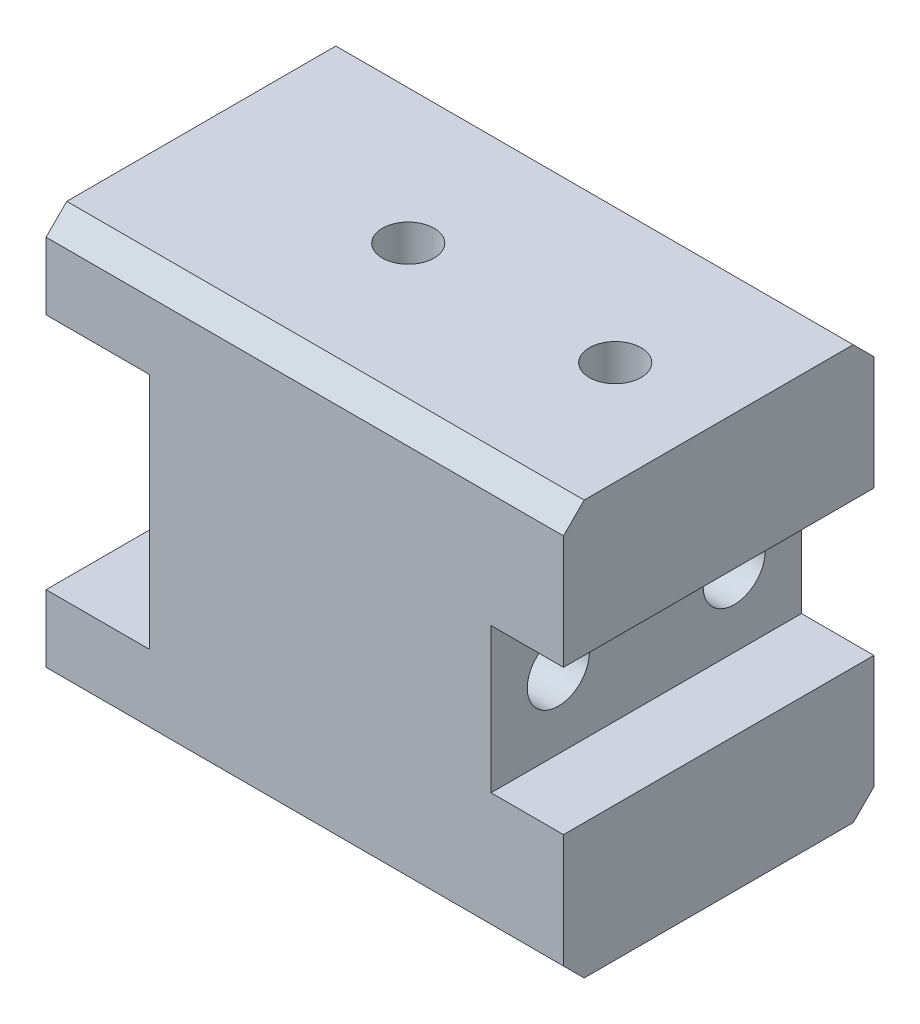
ISO-10303-21;
HEADER;
FILE_DESCRIPTION(('STEP AP214'),'2;1');
FILE_NAME('part.step','',(''),(''),'','','');
FILE_SCHEMA(('AUTOMOTIVE_DESIGN { 1 0 10303 214 1 1 1 1 }'));
ENDSEC;
DATA;
#1=APPLICATION_CONTEXT('core data for automotive mechanical design processes');
#2=APPLICATION_PROTOCOL_DEFINITION('international standard','automotive_design',2000,#1);
#3=PRODUCT_CONTEXT('',#1,'mechanical');
#4=PRODUCT('Part','Part','',(#3));
#5=PRODUCT_RELATED_PRODUCT_CATEGORY('part','',(#4));
#6=PRODUCT_DEFINITION_FORMATION('','',#4);
#7=PRODUCT_DEFINITION_CONTEXT('part definition',#1,'design');
#8=PRODUCT_DEFINITION('design','',#6,#7);
#9=PRODUCT_DEFINITION_SHAPE('','',#8);
#10=(LENGTH_UNIT() NAMED_UNIT(*) SI_UNIT(.MILLI.,.METRE.));
#11=(NAMED_UNIT(*) PLANE_ANGLE_UNIT() SI_UNIT($,.RADIAN.));
#12=(NAMED_UNIT(*) SI_UNIT($,.STERADIAN.) SOLID_ANGLE_UNIT());
#13=UNCERTAINTY_MEASURE_WITH_UNIT(LENGTH_MEASURE(1.E-05),#10,'distance_accuracy_value','');
#14=(GEOMETRIC_REPRESENTATION_CONTEXT(3) GLOBAL_UNCERTAINTY_ASSIGNED_CONTEXT((#13)) GLOBAL_UNIT_ASSIGNED_CONTEXT((#10,
#11,#12)) REPRESENTATION_CONTEXT('',''));
#15=CARTESIAN_POINT('',(0.,0.,0.));
#16=DIRECTION('',(0.,0.,1.));
#17=DIRECTION('',(1.,0.,0.));
#18=AXIS2_PLACEMENT_3D('',#15,#16,#17);
#19=CARTESIAN_POINT('',(25.,0.,0.));
#20=DIRECTION('',(1.,0.,0.));
#21=DIRECTION('',(0.,0.,-1.));
#22=AXIS2_PLACEMENT_3D('',#19,#20,#21);
#23=PLANE('',#22);
#24=DIRECTION('',(0.,0.,1.));
#25=VECTOR('',#24,1.);
#26=CARTESIAN_POINT('',(25.,3.5,-7.5));
#27=LINE('',#26,#25);
#28=CARTESIAN_POINT('',(25.,3.5,-7.5));
#29=VERTEX_POINT('',#28);
#30=CARTESIAN_POINT('',(25.,3.5,7.5));
#31=VERTEX_POINT('',#30);
#32=EDGE_CURVE('E170',#29,#31,#27,.T.);
#33=ORIENTED_EDGE('',*,*,#32,.F.);
#34=DIRECTION('',(0.,1.,0.));
#35=VECTOR('',#34,1.);
#36=CARTESIAN_POINT('',(25.,-10.,-7.5));
#37=LINE('',#36,#35);
#38=CARTESIAN_POINT('',(25.,9.,-7.5));
#39=VERTEX_POINT('',#38);
#40=EDGE_CURVE('E259',#29,#39,#37,.T.);
#41=ORIENTED_EDGE('',*,*,#40,.T.);
#42=DIRECTION('',(0.,-0.70710678118655,-0.707106781186545));
#43=VECTOR('',#42,1.);
#44=CARTESIAN_POINT('',(25.,8.24999999999997,-8.25000000000002));
#45=LINE('',#44,#43);
#46=CARTESIAN_POINT('',(25.,10.,-6.5));
#47=VERTEX_POINT('',#46);
#48=EDGE_CURVE('E306',#39,#47,#45,.F.);
#49=ORIENTED_EDGE('',*,*,#48,.T.);
#50=DIRECTION('',(0.,0.,1.));
#51=VECTOR('',#50,1.);
#52=CARTESIAN_POINT('',(25.,10.,-7.5));
#53=LINE('',#52,#51);
#54=CARTESIAN_POINT('',(25.,10.,6.5));
#55=VERTEX_POINT('',#54);
#56=EDGE_CURVE('E264',#47,#55,#53,.T.);
#57=ORIENTED_EDGE('',*,*,#56,.T.);
#58=DIRECTION('',(0.,0.707106781186547,-0.707106781186548));
#59=VECTOR('',#58,1.);
#60=CARTESIAN_POINT('',(25.,8.25000000000001,8.24999999999999));
#61=LINE('',#60,#59);
#62=CARTESIAN_POINT('',(25.,9.,7.5));
#63=VERTEX_POINT('',#62);
#64=EDGE_CURVE('E303',#55,#63,#61,.F.);
#65=ORIENTED_EDGE('',*,*,#64,.T.);
#66=DIRECTION('',(0.,-1.,0.));
#67=VECTOR('',#66,1.);
#68=CARTESIAN_POINT('',(25.,-10.,7.5));
#69=LINE('',#68,#67);
#70=EDGE_CURVE('E251',#63,#31,#69,.T.);
#71=ORIENTED_EDGE('',*,*,#70,.T.);
#72=EDGE_LOOP('',(#33,#41,#49,#57,#65,#71));
#73=FACE_BOUND('',#72,.T.);
#74=ADVANCED_FACE('F38',(#73),#23,.T.);
#75=CARTESIAN_POINT('',(25.,0.,-4.25));
#76=DIRECTION('',(-1.,0.,0.));
#77=DIRECTION('',(0.,0.,1.));
#78=AXIS2_PLACEMENT_3D('',#75,#76,#77);
#79=CYLINDRICAL_SURFACE('',#78,1.5);
#80=CARTESIAN_POINT('',(5.,0.,-4.25));
#81=DIRECTION('',(-1.,0.,0.));
#82=DIRECTION('',(0.,0.,1.));
#83=AXIS2_PLACEMENT_3D('',#80,#81,#82);
#84=CIRCLE('',#83,1.5);
#85=CARTESIAN_POINT('',(5.,0.,-2.75));
#86=VERTEX_POINT('',#85);
#87=EDGE_CURVE('E194',#86,#86,#84,.T.);
#88=ORIENTED_EDGE('',*,*,#87,.T.);
#89=EDGE_LOOP('',(#88));
#90=FACE_BOUND('',#89,.T.);
#91=CARTESIAN_POINT('',(21.5,0.,-4.25));
#92=DIRECTION('',(1.,0.,0.));
#93=DIRECTION('',(0.,0.,-1.));
#94=AXIS2_PLACEMENT_3D('',#91,#92,#93);
#95=CIRCLE('',#94,1.5);
#96=CARTESIAN_POINT('',(21.5,0.,-5.75));
#97=VERTEX_POINT('',#96);
#98=EDGE_CURVE('E185',#97,#97,#95,.F.);
#99=ORIENTED_EDGE('',*,*,#98,.F.);
#100=EDGE_LOOP('',(#99));
#101=FACE_BOUND('',#100,.T.);
#102=ADVANCED_FACE('F384',(#90,#101),#79,.F.);
#103=CARTESIAN_POINT('',(25.,0.,4.25));
#104=DIRECTION('',(-1.,0.,0.));
#105=DIRECTION('',(0.,0.,1.));
#106=AXIS2_PLACEMENT_3D('',#103,#104,#105);
#107=CYLINDRICAL_SURFACE('',#106,1.5);
#108=CARTESIAN_POINT('',(5.,0.,4.25));
#109=DIRECTION('',(-1.,0.,0.));
#110=DIRECTION('',(0.,0.,1.));
#111=AXIS2_PLACEMENT_3D('',#108,#109,#110);
#112=CIRCLE('',#111,1.5);
#113=CARTESIAN_POINT('',(5.,0.,5.75));
#114=VERTEX_POINT('',#113);
#115=EDGE_CURVE('E206',#114,#114,#112,.T.);
#116=ORIENTED_EDGE('',*,*,#115,.T.);
#117=EDGE_LOOP('',(#116));
#118=FACE_BOUND('',#117,.T.);
#119=CARTESIAN_POINT('',(21.5,0.,4.25));
#120=DIRECTION('',(1.,0.,0.));
#121=DIRECTION('',(0.,0.,-1.));
#122=AXIS2_PLACEMENT_3D('',#119,#120,#121);
#123=CIRCLE('',#122,1.5);
#124=CARTESIAN_POINT('',(21.5,0.,2.75));
#125=VERTEX_POINT('',#124);
#126=EDGE_CURVE('E42',#125,#125,#123,.F.);
#127=ORIENTED_EDGE('',*,*,#126,.F.);
#128=EDGE_LOOP('',(#127));
#129=FACE_BOUND('',#128,.T.);
#130=ADVANCED_FACE('F390',(#118,#129),#107,.F.);
#131=CARTESIAN_POINT('',(0.,0.,0.));
#132=DIRECTION('',(1.,0.,0.));
#133=DIRECTION('',(0.,0.,-1.));
#134=AXIS2_PLACEMENT_3D('',#131,#132,#133);
#135=PLANE('',#134);
#136=DIRECTION('',(0.,0.,1.));
#137=VECTOR('',#136,1.);
#138=CARTESIAN_POINT('',(0.,10.,-7.5));
#139=LINE('',#138,#137);
#140=CARTESIAN_POINT('',(0.,10.,-6.5));
#141=VERTEX_POINT('',#140);
#142=CARTESIAN_POINT('',(0.,10.,6.5));
#143=VERTEX_POINT('',#142);
#144=EDGE_CURVE('E280',#141,#143,#139,.T.);
#145=ORIENTED_EDGE('',*,*,#144,.F.);
#146=DIRECTION('',(0.,0.70710678118655,0.707106781186545));
#147=VECTOR('',#146,1.);
#148=CARTESIAN_POINT('',(0.,10.,-6.5));
#149=LINE('',#148,#147);
#150=CARTESIAN_POINT('',(0.,9.,-7.5));
#151=VERTEX_POINT('',#150);
#152=EDGE_CURVE('E11',#141,#151,#149,.F.);
#153=ORIENTED_EDGE('',*,*,#152,.T.);
#154=DIRECTION('',(0.,1.,0.));
#155=VECTOR('',#154,1.);
#156=CARTESIAN_POINT('',(0.,-10.,-7.5));
#157=LINE('',#156,#155);
#158=CARTESIAN_POINT('',(0.,5.75,-7.5));
#159=VERTEX_POINT('',#158);
#160=EDGE_CURVE('E276',#159,#151,#157,.T.);
#161=ORIENTED_EDGE('',*,*,#160,.F.);
#162=DIRECTION('',(0.,0.,-1.));
#163=VECTOR('',#162,1.);
#164=CARTESIAN_POINT('',(0.,5.75000000000001,7.5));
#165=LINE('',#164,#163);
#166=CARTESIAN_POINT('',(0.,5.75000000000001,7.5));
#167=VERTEX_POINT('',#166);
#168=EDGE_CURVE('E219',#167,#159,#165,.T.);
#169=ORIENTED_EDGE('',*,*,#168,.F.);
#170=DIRECTION('',(0.,-1.,0.));
#171=VECTOR('',#170,1.);
#172=CARTESIAN_POINT('',(0.,-10.,7.5));
#173=LINE('',#172,#171);
#174=CARTESIAN_POINT('',(0.,9.,7.5));
#175=VERTEX_POINT('',#174);
#176=EDGE_CURVE('E269',#175,#167,#173,.T.);
#177=ORIENTED_EDGE('',*,*,#176,.F.);
#178=DIRECTION('',(0.,-0.707106781186547,0.707106781186548));
#179=VECTOR('',#178,1.);
#180=CARTESIAN_POINT('',(0.,9.,7.5));
#181=LINE('',#180,#179);
#182=EDGE_CURVE('E48',#175,#143,#181,.F.);
#183=ORIENTED_EDGE('',*,*,#182,.T.);
#184=EDGE_LOOP('',(#145,#153,#161,#169,#177,#183));
#185=FACE_BOUND('',#184,.T.);
#186=ADVANCED_FACE('F368',(#185),#135,.F.);
#187=CARTESIAN_POINT('',(25.,-10.,7.5));
#188=DIRECTION('',(0.,0.,-1.));
#189=DIRECTION('',(0.,1.,0.));
#190=AXIS2_PLACEMENT_3D('',#187,#188,#189);
#191=PLANE('',#190);
#192=DIRECTION('',(0.,-1.,0.));
#193=VECTOR('',#192,1.);
#194=CARTESIAN_POINT('',(21.5,-3.5,7.5));
#195=LINE('',#194,#193);
#196=CARTESIAN_POINT('',(21.5,3.5,7.5));
#197=VERTEX_POINT('',#196);
#198=CARTESIAN_POINT('',(21.5,-3.5,7.5));
#199=VERTEX_POINT('',#198);
#200=EDGE_CURVE('E159',#197,#199,#195,.T.);
#201=ORIENTED_EDGE('',*,*,#200,.F.);
#202=DIRECTION('',(1.,0.,0.));
#203=VECTOR('',#202,1.);
#204=CARTESIAN_POINT('',(21.5,3.5,7.5));
#205=LINE('',#204,#203);
#206=EDGE_CURVE('E339',#197,#31,#205,.T.);
#207=ORIENTED_EDGE('',*,*,#206,.T.);
#208=ORIENTED_EDGE('',*,*,#70,.F.);
#209=DIRECTION('',(-1.,0.,0.));
#210=VECTOR('',#209,1.);
#211=CARTESIAN_POINT('',(25.,9.,7.5));
#212=LINE('',#211,#210);
#213=EDGE_CURVE('E315',#63,#175,#212,.T.);
#214=ORIENTED_EDGE('',*,*,#213,.T.);
#215=ORIENTED_EDGE('',*,*,#176,.T.);
#216=DIRECTION('',(-1.,0.,0.));
#217=VECTOR('',#216,1.);
#218=CARTESIAN_POINT('',(5.,5.75000000000001,7.5));
#219=LINE('',#218,#217);
#220=CARTESIAN_POINT('',(5.,5.75000000000001,7.5));
#221=VERTEX_POINT('',#220);
#222=EDGE_CURVE('E240',#221,#167,#219,.T.);
#223=ORIENTED_EDGE('',*,*,#222,.F.);
#224=DIRECTION('',(0.,1.,0.));
#225=VECTOR('',#224,1.);
#226=CARTESIAN_POINT('',(5.,-5.74999999999999,7.5));
#227=LINE('',#226,#225);
#228=CARTESIAN_POINT('',(5.,-5.74999999999999,7.5));
#229=VERTEX_POINT('',#228);
#230=EDGE_CURVE('E223',#229,#221,#227,.T.);
#231=ORIENTED_EDGE('',*,*,#230,.F.);
#232=DIRECTION('',(-1.,0.,0.));
#233=VECTOR('',#232,1.);
#234=CARTESIAN_POINT('',(5.,-5.74999999999999,7.5));
#235=LINE('',#234,#233);
#236=CARTESIAN_POINT('',(0.,-5.74999999999999,7.5));
#237=VERTEX_POINT('',#236);
#238=EDGE_CURVE('E244',#229,#237,#235,.T.);
#239=ORIENTED_EDGE('',*,*,#238,.T.);
#240=CARTESIAN_POINT('',(0.,-9.,7.5));
#241=VERTEX_POINT('',#240);
#242=EDGE_CURVE('E239',#237,#241,#173,.T.);
#243=ORIENTED_EDGE('',*,*,#242,.T.);
#244=DIRECTION('',(1.,0.,0.));
#245=VECTOR('',#244,1.);
#246=CARTESIAN_POINT('',(25.,-9.,7.5));
#247=LINE('',#246,#245);
#248=CARTESIAN_POINT('',(25.,-9.,7.5));
#249=VERTEX_POINT('',#248);
#250=EDGE_CURVE('E319',#241,#249,#247,.T.);
#251=ORIENTED_EDGE('',*,*,#250,.T.);
#252=CARTESIAN_POINT('',(25.,-3.5,7.5));
#253=VERTEX_POINT('',#252);
#254=EDGE_CURVE('E175',#253,#249,#69,.T.);
#255=ORIENTED_EDGE('',*,*,#254,.F.);
#256=DIRECTION('',(1.,0.,0.));
#257=VECTOR('',#256,1.);
#258=CARTESIAN_POINT('',(21.5,-3.5,7.5));
#259=LINE('',#258,#257);
#260=EDGE_CURVE('E55',#199,#253,#259,.T.);
#261=ORIENTED_EDGE('',*,*,#260,.F.);
#262=EDGE_LOOP('',(#201,#207,#208,#214,#215,#223,#231,#239,#243,#251,#255,#261));
#263=FACE_BOUND('',#262,.T.);
#264=ADVANCED_FACE('F173',(#263),#191,.F.);
#265=CARTESIAN_POINT('',(25.,-10.,-7.5));
#266=DIRECTION('',(0.,1.,0.));
#267=DIRECTION('',(0.,0.,1.));
#268=AXIS2_PLACEMENT_3D('',#265,#266,#267);
#269=PLANE('',#268);
#270=CARTESIAN_POINT('',(20.,-10.,0.));
#271=DIRECTION('',(0.,1.,0.));
#272=DIRECTION('',(0.,0.,1.));
#273=AXIS2_PLACEMENT_3D('',#270,#271,#272);
#274=CIRCLE('',#273,1.25);
#275=CARTESIAN_POINT('',(20.,-10.,1.25));
#276=VERTEX_POINT('',#275);
#277=EDGE_CURVE('E190',#276,#276,#274,.T.);
#278=ORIENTED_EDGE('',*,*,#277,.T.);
#279=EDGE_LOOP('',(#278));
#280=FACE_BOUND('',#279,.T.);
#281=CARTESIAN_POINT('',(10.,-10.,0.));
#282=DIRECTION('',(0.,1.,0.));
#283=DIRECTION('',(0.,0.,1.));
#284=AXIS2_PLACEMENT_3D('',#281,#282,#283);
#285=CIRCLE('',#284,1.25);
#286=CARTESIAN_POINT('',(10.,-10.,1.25));
#287=VERTEX_POINT('',#286);
#288=EDGE_CURVE('E199',#287,#287,#285,.T.);
#289=ORIENTED_EDGE('',*,*,#288,.T.);
#290=EDGE_LOOP('',(#289));
#291=FACE_BOUND('',#290,.T.);
#292=DIRECTION('',(0.,0.,-1.));
#293=VECTOR('',#292,1.);
#294=CARTESIAN_POINT('',(0.,-10.,-7.5));
#295=LINE('',#294,#293);
#296=CARTESIAN_POINT('',(0.,-10.,6.5));
#297=VERTEX_POINT('',#296);
#298=CARTESIAN_POINT('',(0.,-10.,-6.5));
#299=VERTEX_POINT('',#298);
#300=EDGE_CURVE('E272',#297,#299,#295,.T.);
#301=ORIENTED_EDGE('',*,*,#300,.T.);
#302=DIRECTION('',(1.,0.,0.));
#303=VECTOR('',#302,1.);
#304=CARTESIAN_POINT('',(25.,-10.,-6.5));
#305=LINE('',#304,#303);
#306=CARTESIAN_POINT('',(25.,-10.,-6.5));
#307=VERTEX_POINT('',#306);
#308=EDGE_CURVE('E300',#299,#307,#305,.T.);
#309=ORIENTED_EDGE('',*,*,#308,.T.);
#310=DIRECTION('',(0.,0.,-1.));
#311=VECTOR('',#310,1.);
#312=CARTESIAN_POINT('',(25.,-10.,-7.5));
#313=LINE('',#312,#311);
#314=CARTESIAN_POINT('',(25.,-10.,6.5));
#315=VERTEX_POINT('',#314);
#316=EDGE_CURVE('E255',#315,#307,#313,.T.);
#317=ORIENTED_EDGE('',*,*,#316,.F.);
#318=DIRECTION('',(-1.,0.,0.));
#319=VECTOR('',#318,1.);
#320=CARTESIAN_POINT('',(25.,-10.,6.5));
#321=LINE('',#320,#319);
#322=EDGE_CURVE('E296',#315,#297,#321,.T.);
#323=ORIENTED_EDGE('',*,*,#322,.T.);
#324=EDGE_LOOP('',(#301,#309,#317,#323));
#325=FACE_BOUND('',#324,.T.);
#326=ADVANCED_FACE('F415',(#280,#291,#325),#269,.F.);
#327=CARTESIAN_POINT('',(25.,-10.,-7.5));
#328=DIRECTION('',(0.,0.,1.));
#329=DIRECTION('',(1.,0.,0.));
#330=AXIS2_PLACEMENT_3D('',#327,#328,#329);
#331=PLANE('',#330);
#332=ORIENTED_EDGE('',*,*,#40,.F.);
#333=DIRECTION('',(1.,0.,0.));
#334=VECTOR('',#333,1.);
#335=CARTESIAN_POINT('',(21.5,3.5,-7.5));
#336=LINE('',#335,#334);
#337=CARTESIAN_POINT('',(21.5,3.5,-7.5));
#338=VERTEX_POINT('',#337);
#339=EDGE_CURVE('E180',#338,#29,#336,.T.);
#340=ORIENTED_EDGE('',*,*,#339,.F.);
#341=DIRECTION('',(0.,1.,0.));
#342=VECTOR('',#341,1.);
#343=CARTESIAN_POINT('',(21.5,-3.5,-7.5));
#344=LINE('',#343,#342);
#345=CARTESIAN_POINT('',(21.5,-3.5,-7.5));
#346=VERTEX_POINT('',#345);
#347=EDGE_CURVE('E158',#346,#338,#344,.T.);
#348=ORIENTED_EDGE('',*,*,#347,.F.);
#349=DIRECTION('',(1.,0.,0.));
#350=VECTOR('',#349,1.);
#351=CARTESIAN_POINT('',(21.5,-3.5,-7.5));
#352=LINE('',#351,#350);
#353=CARTESIAN_POINT('',(25.,-3.5,-7.5));
#354=VERTEX_POINT('',#353);
#355=EDGE_CURVE('E154',#346,#354,#352,.T.);
#356=ORIENTED_EDGE('',*,*,#355,.T.);
#357=CARTESIAN_POINT('',(25.,-9.,-7.5));
#358=VERTEX_POINT('',#357);
#359=EDGE_CURVE('E260',#358,#354,#37,.T.);
#360=ORIENTED_EDGE('',*,*,#359,.F.);
#361=DIRECTION('',(-1.,0.,0.));
#362=VECTOR('',#361,1.);
#363=CARTESIAN_POINT('',(25.,-9.,-7.5));
#364=LINE('',#363,#362);
#365=CARTESIAN_POINT('',(0.,-9.,-7.5));
#366=VERTEX_POINT('',#365);
#367=EDGE_CURVE('E286',#358,#366,#364,.T.);
#368=ORIENTED_EDGE('',*,*,#367,.T.);
#369=CARTESIAN_POINT('',(0.,-5.74999999999999,-7.5));
#370=VERTEX_POINT('',#369);
#371=EDGE_CURVE('E277',#366,#370,#157,.T.);
#372=ORIENTED_EDGE('',*,*,#371,.T.);
#373=DIRECTION('',(-1.,0.,0.));
#374=VECTOR('',#373,1.);
#375=CARTESIAN_POINT('',(5.,-5.75,-7.5));
#376=LINE('',#375,#374);
#377=CARTESIAN_POINT('',(5.,-5.75,-7.5));
#378=VERTEX_POINT('',#377);
#379=EDGE_CURVE('E230',#378,#370,#376,.T.);
#380=ORIENTED_EDGE('',*,*,#379,.F.);
#381=DIRECTION('',(0.,-1.,0.));
#382=VECTOR('',#381,1.);
#383=CARTESIAN_POINT('',(5.,-5.75,-7.5));
#384=LINE('',#383,#382);
#385=CARTESIAN_POINT('',(5.,5.75,-7.5));
#386=VERTEX_POINT('',#385);
#387=EDGE_CURVE('E214',#386,#378,#384,.T.);
#388=ORIENTED_EDGE('',*,*,#387,.F.);
#389=DIRECTION('',(-1.,0.,0.));
#390=VECTOR('',#389,1.);
#391=CARTESIAN_POINT('',(5.,5.75,-7.5));
#392=LINE('',#391,#390);
#393=EDGE_CURVE('E235',#386,#159,#392,.T.);
#394=ORIENTED_EDGE('',*,*,#393,.T.);
#395=ORIENTED_EDGE('',*,*,#160,.T.);
#396=DIRECTION('',(1.,0.,0.));
#397=VECTOR('',#396,1.);
#398=CARTESIAN_POINT('',(25.,9.,-7.5));
#399=LINE('',#398,#397);
#400=EDGE_CURVE('E268',#151,#39,#399,.T.);
#401=ORIENTED_EDGE('',*,*,#400,.T.);
#402=EDGE_LOOP('',(#332,#340,#348,#356,#360,#368,#372,#380,#388,#394,#395,#401));
#403=FACE_BOUND('',#402,.T.);
#404=ADVANCED_FACE('F355',(#403),#331,.F.);
#405=CARTESIAN_POINT('',(25.,10.,-7.5));
#406=DIRECTION('',(0.,-1.,0.));
#407=DIRECTION('',(0.,0.,-1.));
#408=AXIS2_PLACEMENT_3D('',#405,#406,#407);
#409=PLANE('',#408);
#410=CARTESIAN_POINT('',(20.,10.,0.));
#411=DIRECTION('',(0.,1.,0.));
#412=DIRECTION('',(0.,0.,1.));
#413=AXIS2_PLACEMENT_3D('',#410,#411,#412);
#414=CIRCLE('',#413,1.25);
#415=CARTESIAN_POINT('',(20.,10.,1.25));
#416=VERTEX_POINT('',#415);
#417=EDGE_CURVE('E195',#416,#416,#414,.T.);
#418=ORIENTED_EDGE('',*,*,#417,.F.);
#419=EDGE_LOOP('',(#418));
#420=FACE_BOUND('',#419,.T.);
#421=CARTESIAN_POINT('',(10.,10.,0.));
#422=DIRECTION('',(0.,1.,0.));
#423=DIRECTION('',(0.,0.,1.));
#424=AXIS2_PLACEMENT_3D('',#421,#422,#423);
#425=CIRCLE('',#424,1.25);
#426=CARTESIAN_POINT('',(10.,10.,1.25));
#427=VERTEX_POINT('',#426);
#428=EDGE_CURVE('E189',#427,#427,#425,.T.);
#429=ORIENTED_EDGE('',*,*,#428,.F.);
#430=EDGE_LOOP('',(#429));
#431=FACE_BOUND('',#430,.T.);
#432=ORIENTED_EDGE('',*,*,#56,.F.);
#433=DIRECTION('',(-1.,0.,0.));
#434=VECTOR('',#433,1.);
#435=CARTESIAN_POINT('',(25.,10.,-6.5));
#436=LINE('',#435,#434);
#437=EDGE_CURVE('E325',#47,#141,#436,.T.);
#438=ORIENTED_EDGE('',*,*,#437,.T.);
#439=ORIENTED_EDGE('',*,*,#144,.T.);
#440=DIRECTION('',(1.,0.,0.));
#441=VECTOR('',#440,1.);
#442=CARTESIAN_POINT('',(25.,10.,6.5));
#443=LINE('',#442,#441);
#444=EDGE_CURVE('E322',#143,#55,#443,.T.);
#445=ORIENTED_EDGE('',*,*,#444,.T.);
#446=EDGE_LOOP('',(#432,#438,#439,#445));
#447=FACE_BOUND('',#446,.T.);
#448=ADVANCED_FACE('F366',(#420,#431,#447),#409,.F.);
#449=DIRECTION('',(0.,0.,-1.));
#450=VECTOR('',#449,1.);
#451=CARTESIAN_POINT('',(25.,-3.5,-7.5));
#452=LINE('',#451,#450);
#453=EDGE_CURVE('E348',#253,#354,#452,.T.);
#454=ORIENTED_EDGE('',*,*,#453,.F.);
#455=ORIENTED_EDGE('',*,*,#254,.T.);
#456=DIRECTION('',(0.,0.70710678118655,0.707106781186545));
#457=VECTOR('',#456,1.);
#458=CARTESIAN_POINT('',(25.,-8.24999999999996,8.25000000000003));
#459=LINE('',#458,#457);
#460=EDGE_CURVE('E309',#249,#315,#459,.F.);
#461=ORIENTED_EDGE('',*,*,#460,.T.);
#462=ORIENTED_EDGE('',*,*,#316,.T.);
#463=DIRECTION('',(0.,-0.707106781186546,0.707106781186549));
#464=VECTOR('',#463,1.);
#465=CARTESIAN_POINT('',(25.,-8.25000000000001,-8.24999999999999));
#466=LINE('',#465,#464);
#467=EDGE_CURVE('E312',#307,#358,#466,.F.);
#468=ORIENTED_EDGE('',*,*,#467,.T.);
#469=ORIENTED_EDGE('',*,*,#359,.T.);
#470=EDGE_LOOP('',(#454,#455,#461,#462,#468,#469));
#471=FACE_BOUND('',#470,.T.);
#472=ADVANCED_FACE('F386',(#471),#23,.T.);
#473=ORIENTED_EDGE('',*,*,#371,.F.);
#474=DIRECTION('',(0.,0.707106781186546,-0.707106781186549));
#475=VECTOR('',#474,1.);
#476=CARTESIAN_POINT('',(0.,-9.,-7.5));
#477=LINE('',#476,#475);
#478=EDGE_CURVE('E293',#366,#299,#477,.F.);
#479=ORIENTED_EDGE('',*,*,#478,.T.);
#480=ORIENTED_EDGE('',*,*,#300,.F.);
#481=DIRECTION('',(0.,-0.70710678118655,-0.707106781186545));
#482=VECTOR('',#481,1.);
#483=CARTESIAN_POINT('',(0.,-10.,6.5));
#484=LINE('',#483,#482);
#485=EDGE_CURVE('E290',#297,#241,#484,.F.);
#486=ORIENTED_EDGE('',*,*,#485,.T.);
#487=ORIENTED_EDGE('',*,*,#242,.F.);
#488=DIRECTION('',(0.,0.,1.));
#489=VECTOR('',#488,1.);
#490=CARTESIAN_POINT('',(0.,-5.74999999999999,7.5));
#491=LINE('',#490,#489);
#492=EDGE_CURVE('E210',#370,#237,#491,.T.);
#493=ORIENTED_EDGE('',*,*,#492,.F.);
#494=EDGE_LOOP('',(#473,#479,#480,#486,#487,#493));
#495=FACE_BOUND('',#494,.T.);
#496=ADVANCED_FACE('F396',(#495),#135,.F.);
#497=CARTESIAN_POINT('',(5.,5.75000000000001,7.5));
#498=DIRECTION('',(0.,1.,0.));
#499=DIRECTION('',(0.,0.,1.));
#500=AXIS2_PLACEMENT_3D('',#497,#498,#499);
#501=PLANE('',#500);
#502=ORIENTED_EDGE('',*,*,#168,.T.);
#503=ORIENTED_EDGE('',*,*,#393,.F.);
#504=DIRECTION('',(0.,0.,-1.));
#505=VECTOR('',#504,1.);
#506=CARTESIAN_POINT('',(5.,5.75000000000001,7.5));
#507=LINE('',#506,#505);
#508=EDGE_CURVE('E226',#221,#386,#507,.T.);
#509=ORIENTED_EDGE('',*,*,#508,.F.);
#510=ORIENTED_EDGE('',*,*,#222,.T.);
#511=EDGE_LOOP('',(#502,#503,#509,#510));
#512=FACE_BOUND('',#511,.T.);
#513=ADVANCED_FACE('F402',(#512),#501,.F.);
#514=CARTESIAN_POINT('',(5.,-5.74999999999999,7.5));
#515=DIRECTION('',(0.,-1.,0.));
#516=DIRECTION('',(0.,0.,-1.));
#517=AXIS2_PLACEMENT_3D('',#514,#515,#516);
#518=PLANE('',#517);
#519=ORIENTED_EDGE('',*,*,#492,.T.);
#520=ORIENTED_EDGE('',*,*,#238,.F.);
#521=DIRECTION('',(0.,0.,1.));
#522=VECTOR('',#521,1.);
#523=CARTESIAN_POINT('',(5.,-5.74999999999999,7.5));
#524=LINE('',#523,#522);
#525=EDGE_CURVE('E218',#378,#229,#524,.T.);
#526=ORIENTED_EDGE('',*,*,#525,.F.);
#527=ORIENTED_EDGE('',*,*,#379,.T.);
#528=EDGE_LOOP('',(#519,#520,#526,#527));
#529=FACE_BOUND('',#528,.T.);
#530=ADVANCED_FACE('F424',(#529),#518,.F.);
#531=CARTESIAN_POINT('',(5.,0.,0.));
#532=DIRECTION('',(-1.,0.,0.));
#533=DIRECTION('',(0.,0.,1.));
#534=AXIS2_PLACEMENT_3D('',#531,#532,#533);
#535=PLANE('',#534);
#536=ORIENTED_EDGE('',*,*,#115,.F.);
#537=EDGE_LOOP('',(#536));
#538=FACE_BOUND('',#537,.T.);
#539=ORIENTED_EDGE('',*,*,#87,.F.);
#540=EDGE_LOOP('',(#539));
#541=FACE_BOUND('',#540,.T.);
#542=ORIENTED_EDGE('',*,*,#387,.T.);
#543=ORIENTED_EDGE('',*,*,#525,.T.);
#544=ORIENTED_EDGE('',*,*,#230,.T.);
#545=ORIENTED_EDGE('',*,*,#508,.T.);
#546=EDGE_LOOP('',(#542,#543,#544,#545));
#547=FACE_BOUND('',#546,.T.);
#548=ADVANCED_FACE('F426',(#538,#541,#547),#535,.T.);
#549=CARTESIAN_POINT('',(10.,-10.,0.));
#550=DIRECTION('',(0.,1.,0.));
#551=DIRECTION('',(0.,0.,1.));
#552=AXIS2_PLACEMENT_3D('',#549,#550,#551);
#553=CYLINDRICAL_SURFACE('',#552,1.25);
#554=ORIENTED_EDGE('',*,*,#288,.F.);
#555=EDGE_LOOP('',(#554));
#556=FACE_BOUND('',#555,.T.);
#557=ORIENTED_EDGE('',*,*,#428,.T.);
#558=EDGE_LOOP('',(#557));
#559=FACE_BOUND('',#558,.T.);
#560=ADVANCED_FACE('F437',(#556,#559),#553,.F.);
#561=CARTESIAN_POINT('',(20.,-10.,0.));
#562=DIRECTION('',(0.,1.,0.));
#563=DIRECTION('',(0.,0.,1.));
#564=AXIS2_PLACEMENT_3D('',#561,#562,#563);
#565=CYLINDRICAL_SURFACE('',#564,1.25);
#566=ORIENTED_EDGE('',*,*,#277,.F.);
#567=EDGE_LOOP('',(#566));
#568=FACE_BOUND('',#567,.T.);
#569=ORIENTED_EDGE('',*,*,#417,.T.);
#570=EDGE_LOOP('',(#569));
#571=FACE_BOUND('',#570,.T.);
#572=ADVANCED_FACE('F445',(#568,#571),#565,.F.);
#573=CARTESIAN_POINT('',(25.,-9.,-7.5));
#574=DIRECTION('',(0.,0.707106781186549,0.707106781186546));
#575=DIRECTION('',(-1.,0.,0.));
#576=AXIS2_PLACEMENT_3D('',#573,#574,#575);
#577=PLANE('',#576);
#578=ORIENTED_EDGE('',*,*,#467,.F.);
#579=ORIENTED_EDGE('',*,*,#308,.F.);
#580=ORIENTED_EDGE('',*,*,#478,.F.);
#581=ORIENTED_EDGE('',*,*,#367,.F.);
#582=EDGE_LOOP('',(#578,#579,#580,#581));
#583=FACE_BOUND('',#582,.T.);
#584=ADVANCED_FACE('F380',(#583),#577,.F.);
#585=CARTESIAN_POINT('',(25.,-10.,6.5));
#586=DIRECTION('',(0.,0.707106781186545,-0.70710678118655));
#587=DIRECTION('',(-1.,0.,0.));
#588=AXIS2_PLACEMENT_3D('',#585,#586,#587);
#589=PLANE('',#588);
#590=ORIENTED_EDGE('',*,*,#460,.F.);
#591=ORIENTED_EDGE('',*,*,#250,.F.);
#592=ORIENTED_EDGE('',*,*,#485,.F.);
#593=ORIENTED_EDGE('',*,*,#322,.F.);
#594=EDGE_LOOP('',(#590,#591,#592,#593));
#595=FACE_BOUND('',#594,.T.);
#596=ADVANCED_FACE('F375',(#595),#589,.F.);
#597=CARTESIAN_POINT('',(25.,10.,-6.5));
#598=DIRECTION('',(0.,-0.707106781186545,0.70710678118655));
#599=DIRECTION('',(-1.,0.,0.));
#600=AXIS2_PLACEMENT_3D('',#597,#598,#599);
#601=PLANE('',#600);
#602=ORIENTED_EDGE('',*,*,#48,.F.);
#603=ORIENTED_EDGE('',*,*,#400,.F.);
#604=ORIENTED_EDGE('',*,*,#152,.F.);
#605=ORIENTED_EDGE('',*,*,#437,.F.);
#606=EDGE_LOOP('',(#602,#603,#604,#605));
#607=FACE_BOUND('',#606,.T.);
#608=ADVANCED_FACE('F373',(#607),#601,.F.);
#609=CARTESIAN_POINT('',(25.,9.,7.5));
#610=DIRECTION('',(0.,-0.707106781186548,-0.707106781186547));
#611=DIRECTION('',(-1.,0.,0.));
#612=AXIS2_PLACEMENT_3D('',#609,#610,#611);
#613=PLANE('',#612);
#614=ORIENTED_EDGE('',*,*,#64,.F.);
#615=ORIENTED_EDGE('',*,*,#444,.F.);
#616=ORIENTED_EDGE('',*,*,#182,.F.);
#617=ORIENTED_EDGE('',*,*,#213,.F.);
#618=EDGE_LOOP('',(#614,#615,#616,#617));
#619=FACE_BOUND('',#618,.T.);
#620=ADVANCED_FACE('F40',(#619),#613,.F.);
#621=CARTESIAN_POINT('',(21.5,0.,0.));
#622=DIRECTION('',(1.,0.,0.));
#623=DIRECTION('',(0.,0.,-1.));
#624=AXIS2_PLACEMENT_3D('',#621,#622,#623);
#625=PLANE('',#624);
#626=ORIENTED_EDGE('',*,*,#200,.T.);
#627=DIRECTION('',(0.,0.,-1.));
#628=VECTOR('',#627,1.);
#629=CARTESIAN_POINT('',(21.5,-3.5,-7.5));
#630=LINE('',#629,#628);
#631=EDGE_CURVE('E150',#199,#346,#630,.T.);
#632=ORIENTED_EDGE('',*,*,#631,.T.);
#633=ORIENTED_EDGE('',*,*,#347,.T.);
#634=DIRECTION('',(0.,0.,1.));
#635=VECTOR('',#634,1.);
#636=CARTESIAN_POINT('',(21.5,3.5,-7.5));
#637=LINE('',#636,#635);
#638=EDGE_CURVE('E166',#338,#197,#637,.T.);
#639=ORIENTED_EDGE('',*,*,#638,.T.);
#640=EDGE_LOOP('',(#626,#632,#633,#639));
#641=FACE_BOUND('',#640,.T.);
#642=ORIENTED_EDGE('',*,*,#126,.T.);
#643=EDGE_LOOP('',(#642));
#644=FACE_BOUND('',#643,.T.);
#645=ORIENTED_EDGE('',*,*,#98,.T.);
#646=EDGE_LOOP('',(#645));
#647=FACE_BOUND('',#646,.T.);
#648=ADVANCED_FACE('F163',(#641,#644,#647),#625,.T.);
#649=CARTESIAN_POINT('',(21.5,3.5,-7.5));
#650=DIRECTION('',(0.,1.,0.));
#651=DIRECTION('',(0.,0.,1.));
#652=AXIS2_PLACEMENT_3D('',#649,#650,#651);
#653=PLANE('',#652);
#654=ORIENTED_EDGE('',*,*,#32,.T.);
#655=ORIENTED_EDGE('',*,*,#206,.F.);
#656=ORIENTED_EDGE('',*,*,#638,.F.);
#657=ORIENTED_EDGE('',*,*,#339,.T.);
#658=EDGE_LOOP('',(#654,#655,#656,#657));
#659=FACE_BOUND('',#658,.T.);
#660=ADVANCED_FACE('F353',(#659),#653,.F.);
#661=CARTESIAN_POINT('',(21.5,-3.5,-7.5));
#662=DIRECTION('',(0.,-1.,0.));
#663=DIRECTION('',(0.,0.,-1.));
#664=AXIS2_PLACEMENT_3D('',#661,#662,#663);
#665=PLANE('',#664);
#666=ORIENTED_EDGE('',*,*,#453,.T.);
#667=ORIENTED_EDGE('',*,*,#355,.F.);
#668=ORIENTED_EDGE('',*,*,#631,.F.);
#669=ORIENTED_EDGE('',*,*,#260,.T.);
#670=EDGE_LOOP('',(#666,#667,#668,#669));
#671=FACE_BOUND('',#670,.T.);
#672=ADVANCED_FACE('F152',(#671),#665,.F.);
#673=CLOSED_SHELL('',(#74,#102,#130,#186,#264,#326,#404,#448,#472,#496,#513,#530,#548,#560,#572,
#584,#596,#608,#620,#648,#660,#672));
#674=MANIFOLD_SOLID_BREP('B2',#673);
#675=ADVANCED_BREP_SHAPE_REPRESENTATION('',(#18,#674),#14);
#676=SHAPE_DEFINITION_REPRESENTATION(#9,#675);
ENDSEC;
END-ISO-10303-21;
